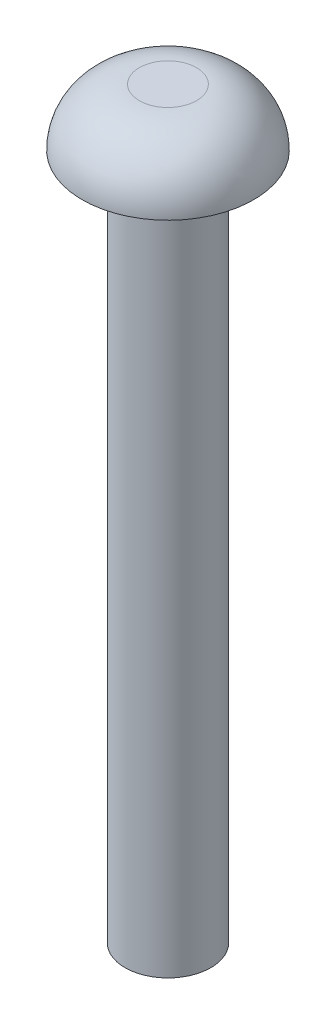
ISO-10303-21;
HEADER;
FILE_DESCRIPTION(('STEP AP214'),'2;1');
FILE_NAME('part.step','',(''),(''),'','','');
FILE_SCHEMA(('AUTOMOTIVE_DESIGN { 1 0 10303 214 1 1 1 1 }'));
ENDSEC;
DATA;
#1=APPLICATION_CONTEXT('core data for automotive mechanical design processes');
#2=APPLICATION_PROTOCOL_DEFINITION('international standard','automotive_design',2000,#1);
#3=PRODUCT_CONTEXT('',#1,'mechanical');
#4=PRODUCT('Part','Part','',(#3));
#5=PRODUCT_RELATED_PRODUCT_CATEGORY('part','',(#4));
#6=PRODUCT_DEFINITION_FORMATION('','',#4);
#7=PRODUCT_DEFINITION_CONTEXT('part definition',#1,'design');
#8=PRODUCT_DEFINITION('design','',#6,#7);
#9=PRODUCT_DEFINITION_SHAPE('','',#8);
#10=(LENGTH_UNIT() NAMED_UNIT(*) SI_UNIT(.MILLI.,.METRE.));
#11=(NAMED_UNIT(*) PLANE_ANGLE_UNIT() SI_UNIT($,.RADIAN.));
#12=(NAMED_UNIT(*) SI_UNIT($,.STERADIAN.) SOLID_ANGLE_UNIT());
#13=UNCERTAINTY_MEASURE_WITH_UNIT(LENGTH_MEASURE(1.E-05),#10,'distance_accuracy_value','');
#14=(GEOMETRIC_REPRESENTATION_CONTEXT(3) GLOBAL_UNCERTAINTY_ASSIGNED_CONTEXT((#13)) GLOBAL_UNIT_ASSIGNED_CONTEXT((#10,
#11,#12)) REPRESENTATION_CONTEXT('',''));
#15=CARTESIAN_POINT('',(0.,0.,0.));
#16=DIRECTION('',(0.,0.,1.));
#17=DIRECTION('',(1.,0.,0.));
#18=AXIS2_PLACEMENT_3D('',#15,#16,#17);
#19=CARTESIAN_POINT('',(0.,8.,0.));
#20=DIRECTION('',(0.,1.,0.));
#21=DIRECTION('',(-1.00000000000001,0.,0.));
#22=AXIS2_PLACEMENT_3D('',#19,#20,#21);
#23=PLANE('',#22);
#24=CARTESIAN_POINT('',(6.,8.,0.));
#25=DIRECTION('',(0.,1.,0.));
#26=DIRECTION('',(-1.00000000000001,0.,0.));
#27=AXIS2_PLACEMENT_3D('',#24,#25,#26);
#28=CIRCLE('',#27,4.);
#29=CARTESIAN_POINT('',(1.99999999999996,8.,0.));
#30=VERTEX_POINT('',#29);
#31=EDGE_CURVE('E12',#30,#30,#28,.T.);
#32=ORIENTED_EDGE('',*,*,#31,.T.);
#33=EDGE_LOOP('',(#32));
#34=FACE_BOUND('',#33,.T.);
#35=ADVANCED_FACE('F53',(#34),#23,.T.);
#36=CARTESIAN_POINT('',(6.,0.,0.));
#37=DIRECTION('',(0.,1.,0.));
#38=DIRECTION('',(-1.00000000000001,0.,0.));
#39=AXIS2_PLACEMENT_3D('',#36,#37,#38);
#40=DEGENERATE_TOROIDAL_SURFACE('',#39,4.,8.,.T.);
#41=CARTESIAN_POINT('',(6.,0.,0.));
#42=DIRECTION('',(0.,1.,0.));
#43=DIRECTION('',(-1.00000000000001,0.,0.));
#44=AXIS2_PLACEMENT_3D('',#41,#42,#43);
#45=CIRCLE('',#44,12.);
#46=CARTESIAN_POINT('',(-6.00000000000013,0.,0.));
#47=VERTEX_POINT('',#46);
#48=EDGE_CURVE('E60',#47,#47,#45,.T.);
#49=ORIENTED_EDGE('',*,*,#48,.T.);
#50=EDGE_LOOP('',(#49));
#51=FACE_BOUND('',#50,.T.);
#52=ORIENTED_EDGE('',*,*,#31,.F.);
#53=EDGE_LOOP('',(#52));
#54=FACE_BOUND('',#53,.T.);
#55=ADVANCED_FACE('F92',(#51,#54),#40,.T.);
#56=CARTESIAN_POINT('',(0.,0.,0.));
#57=DIRECTION('',(0.,1.,0.));
#58=DIRECTION('',(-1.00000000000001,0.,0.));
#59=AXIS2_PLACEMENT_3D('',#56,#57,#58);
#60=PLANE('',#59);
#61=ORIENTED_EDGE('',*,*,#48,.F.);
#62=EDGE_LOOP('',(#61));
#63=FACE_BOUND('',#62,.T.);
#64=CARTESIAN_POINT('',(6.,0.,0.));
#65=DIRECTION('',(0.,1.,0.));
#66=DIRECTION('',(-1.00000000000001,0.,0.));
#67=AXIS2_PLACEMENT_3D('',#64,#65,#66);
#68=CIRCLE('',#67,6.);
#69=CARTESIAN_POINT('',(0.,0.,0.));
#70=VERTEX_POINT('',#69);
#71=EDGE_CURVE('E66',#70,#70,#68,.T.);
#72=ORIENTED_EDGE('',*,*,#71,.T.);
#73=EDGE_LOOP('',(#72));
#74=FACE_BOUND('',#73,.T.);
#75=ADVANCED_FACE('F89',(#63,#74),#60,.F.);
#76=CARTESIAN_POINT('',(6.,0.,0.));
#77=DIRECTION('',(0.,1.,0.));
#78=DIRECTION('',(-1.00000000000001,0.,0.));
#79=AXIS2_PLACEMENT_3D('',#76,#77,#78);
#80=CYLINDRICAL_SURFACE('',#79,6.00000000000001);
#81=CARTESIAN_POINT('',(6.00000000000001,-96.,0.));
#82=DIRECTION('',(0.,1.,0.));
#83=DIRECTION('',(-1.00000000000001,0.,0.));
#84=AXIS2_PLACEMENT_3D('',#81,#82,#83);
#85=CIRCLE('',#84,6.00000000000001);
#86=CARTESIAN_POINT('',(0.,-96.,0.));
#87=VERTEX_POINT('',#86);
#88=EDGE_CURVE('E72',#87,#87,#85,.T.);
#89=ORIENTED_EDGE('',*,*,#88,.T.);
#90=EDGE_LOOP('',(#89));
#91=FACE_BOUND('',#90,.T.);
#92=ORIENTED_EDGE('',*,*,#71,.F.);
#93=EDGE_LOOP('',(#92));
#94=FACE_BOUND('',#93,.T.);
#95=ADVANCED_FACE('F80',(#91,#94),#80,.T.);
#96=CARTESIAN_POINT('',(0.,-96.,0.));
#97=DIRECTION('',(0.,-1.,0.));
#98=DIRECTION('',(1.00000000000001,0.,0.));
#99=AXIS2_PLACEMENT_3D('',#96,#97,#98);
#100=PLANE('',#99);
#101=ORIENTED_EDGE('',*,*,#88,.F.);
#102=EDGE_LOOP('',(#101));
#103=FACE_BOUND('',#102,.T.);
#104=ADVANCED_FACE('F83',(#103),#100,.T.);
#105=CLOSED_SHELL('',(#35,#55,#75,#95,#104));
#106=MANIFOLD_SOLID_BREP('B2',#105);
#107=ADVANCED_BREP_SHAPE_REPRESENTATION('',(#18,#106),#14);
#108=SHAPE_DEFINITION_REPRESENTATION(#9,#107);
ENDSEC;
END-ISO-10303-21;
